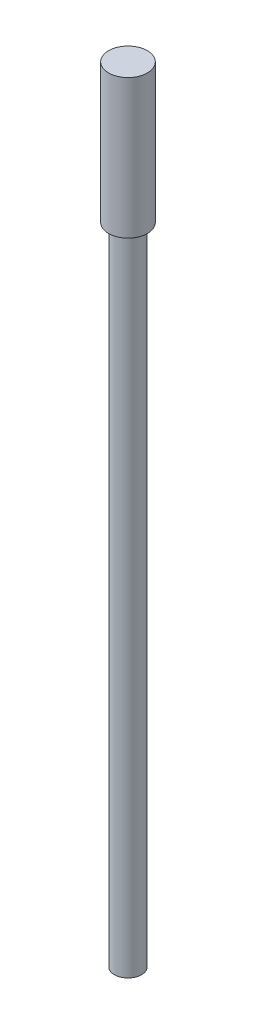
ISO-10303-21;
HEADER;
FILE_DESCRIPTION(('STEP AP214'),'2;1');
FILE_NAME('part.step','',(''),(''),'','','');
FILE_SCHEMA(('AUTOMOTIVE_DESIGN { 1 0 10303 214 1 1 1 1 }'));
ENDSEC;
DATA;
#1=APPLICATION_CONTEXT('core data for automotive mechanical design processes');
#2=APPLICATION_PROTOCOL_DEFINITION('international standard','automotive_design',2000,#1);
#3=PRODUCT_CONTEXT('',#1,'mechanical');
#4=PRODUCT('Part','Part','',(#3));
#5=PRODUCT_RELATED_PRODUCT_CATEGORY('part','',(#4));
#6=PRODUCT_DEFINITION_FORMATION('','',#4);
#7=PRODUCT_DEFINITION_CONTEXT('part definition',#1,'design');
#8=PRODUCT_DEFINITION('design','',#6,#7);
#9=PRODUCT_DEFINITION_SHAPE('','',#8);
#10=(LENGTH_UNIT() NAMED_UNIT(*) SI_UNIT(.MILLI.,.METRE.));
#11=(NAMED_UNIT(*) PLANE_ANGLE_UNIT() SI_UNIT($,.RADIAN.));
#12=(NAMED_UNIT(*) SI_UNIT($,.STERADIAN.) SOLID_ANGLE_UNIT());
#13=UNCERTAINTY_MEASURE_WITH_UNIT(LENGTH_MEASURE(1.E-05),#10,'distance_accuracy_value','');
#14=(GEOMETRIC_REPRESENTATION_CONTEXT(3) GLOBAL_UNCERTAINTY_ASSIGNED_CONTEXT((#13)) GLOBAL_UNIT_ASSIGNED_CONTEXT((#10,
#11,#12)) REPRESENTATION_CONTEXT('',''));
#15=CARTESIAN_POINT('',(0.,0.,0.));
#16=DIRECTION('',(0.,0.,1.));
#17=DIRECTION('',(1.,0.,0.));
#18=AXIS2_PLACEMENT_3D('',#15,#16,#17);
#19=CARTESIAN_POINT('',(0.,620.,0.));
#20=DIRECTION('',(0.,-1.,0.));
#21=DIRECTION('',(0.,0.,-1.));
#22=AXIS2_PLACEMENT_3D('',#19,#20,#21);
#23=CYLINDRICAL_SURFACE('',#22,10.75);
#24=CARTESIAN_POINT('',(0.,0.,0.));
#25=DIRECTION('',(0.,1.,0.));
#26=DIRECTION('',(0.,0.,1.));
#27=AXIS2_PLACEMENT_3D('',#24,#25,#26);
#28=CIRCLE('',#27,10.75);
#29=CARTESIAN_POINT('',(0.,0.,10.75));
#30=VERTEX_POINT('',#29);
#31=EDGE_CURVE('E55',#30,#30,#28,.T.);
#32=ORIENTED_EDGE('',*,*,#31,.T.);
#33=EDGE_LOOP('',(#32));
#34=FACE_BOUND('',#33,.T.);
#35=CARTESIAN_POINT('',(0.,510.,0.));
#36=DIRECTION('',(0.,1.,0.));
#37=DIRECTION('',(0.,0.,1.));
#38=AXIS2_PLACEMENT_3D('',#35,#36,#37);
#39=CIRCLE('',#38,10.75);
#40=CARTESIAN_POINT('',(0.,510.,10.75));
#41=VERTEX_POINT('',#40);
#42=EDGE_CURVE('E12',#41,#41,#39,.T.);
#43=ORIENTED_EDGE('',*,*,#42,.F.);
#44=EDGE_LOOP('',(#43));
#45=FACE_BOUND('',#44,.T.);
#46=ADVANCED_FACE('F48',(#34,#45),#23,.T.);
#47=CARTESIAN_POINT('',(0.,620.,0.));
#48=DIRECTION('',(0.,-1.,0.));
#49=DIRECTION('',(0.,0.,-1.));
#50=AXIS2_PLACEMENT_3D('',#47,#48,#49);
#51=CYLINDRICAL_SURFACE('',#50,7.75);
#52=CARTESIAN_POINT('',(0.,0.,0.));
#53=DIRECTION('',(0.,1.,0.));
#54=DIRECTION('',(0.,0.,1.));
#55=AXIS2_PLACEMENT_3D('',#52,#53,#54);
#56=CIRCLE('',#55,7.75);
#57=CARTESIAN_POINT('',(0.,0.,7.75000000000002));
#58=VERTEX_POINT('',#57);
#59=EDGE_CURVE('E60',#58,#58,#56,.T.);
#60=ORIENTED_EDGE('',*,*,#59,.F.);
#61=EDGE_LOOP('',(#60));
#62=FACE_BOUND('',#61,.T.);
#63=CARTESIAN_POINT('',(0.,510.,0.));
#64=DIRECTION('',(0.,1.,0.));
#65=DIRECTION('',(0.,0.,1.));
#66=AXIS2_PLACEMENT_3D('',#63,#64,#65);
#67=CIRCLE('',#66,7.75);
#68=CARTESIAN_POINT('',(0.,510.,7.75000000000002));
#69=VERTEX_POINT('',#68);
#70=EDGE_CURVE('E51',#69,#69,#67,.T.);
#71=ORIENTED_EDGE('',*,*,#70,.T.);
#72=EDGE_LOOP('',(#71));
#73=FACE_BOUND('',#72,.T.);
#74=ADVANCED_FACE('F94',(#62,#73),#51,.F.);
#75=CARTESIAN_POINT('',(0.,0.,0.));
#76=DIRECTION('',(0.,1.,0.));
#77=DIRECTION('',(0.,0.,1.));
#78=AXIS2_PLACEMENT_3D('',#75,#76,#77);
#79=PLANE('',#78);
#80=ORIENTED_EDGE('',*,*,#31,.F.);
#81=EDGE_LOOP('',(#80));
#82=FACE_BOUND('',#81,.T.);
#83=ORIENTED_EDGE('',*,*,#59,.T.);
#84=EDGE_LOOP('',(#83));
#85=FACE_BOUND('',#84,.T.);
#86=ADVANCED_FACE('F90',(#82,#85),#79,.F.);
#87=CARTESIAN_POINT('',(0.,510.,0.));
#88=DIRECTION('',(0.,1.,0.));
#89=DIRECTION('',(0.,0.,1.));
#90=AXIS2_PLACEMENT_3D('',#87,#88,#89);
#91=PLANE('',#90);
#92=ORIENTED_EDGE('',*,*,#70,.F.);
#93=EDGE_LOOP('',(#92));
#94=FACE_BOUND('',#93,.T.);
#95=ADVANCED_FACE('F83',(#94),#91,.F.);
#96=CARTESIAN_POINT('',(0.,510.,0.));
#97=DIRECTION('',(0.,1.,0.));
#98=DIRECTION('',(0.,0.,1.));
#99=AXIS2_PLACEMENT_3D('',#96,#97,#98);
#100=CYLINDRICAL_SURFACE('',#99,15.3015806275291);
#101=CARTESIAN_POINT('',(0.,510.,0.));
#102=DIRECTION('',(0.,1.,0.));
#103=DIRECTION('',(0.,0.,1.));
#104=AXIS2_PLACEMENT_3D('',#101,#102,#103);
#105=CIRCLE('',#104,15.3015806275291);
#106=CARTESIAN_POINT('',(0.,510.,15.3015806275292));
#107=VERTEX_POINT('',#106);
#108=EDGE_CURVE('E69',#107,#107,#105,.T.);
#109=ORIENTED_EDGE('',*,*,#108,.T.);
#110=EDGE_LOOP('',(#109));
#111=FACE_BOUND('',#110,.T.);
#112=CARTESIAN_POINT('',(0.,620.,0.));
#113=DIRECTION('',(0.,1.,0.));
#114=DIRECTION('',(0.,0.,1.));
#115=AXIS2_PLACEMENT_3D('',#112,#113,#114);
#116=CIRCLE('',#115,15.3015806275291);
#117=CARTESIAN_POINT('',(0.,620.,15.3015806275292));
#118=VERTEX_POINT('',#117);
#119=EDGE_CURVE('E63',#118,#118,#116,.T.);
#120=ORIENTED_EDGE('',*,*,#119,.F.);
#121=EDGE_LOOP('',(#120));
#122=FACE_BOUND('',#121,.T.);
#123=ADVANCED_FACE('F80',(#111,#122),#100,.T.);
#124=ORIENTED_EDGE('',*,*,#42,.T.);
#125=EDGE_LOOP('',(#124));
#126=FACE_BOUND('',#125,.T.);
#127=ORIENTED_EDGE('',*,*,#108,.F.);
#128=EDGE_LOOP('',(#127));
#129=FACE_BOUND('',#128,.T.);
#130=ADVANCED_FACE('F82',(#126,#129),#91,.F.);
#131=CARTESIAN_POINT('',(0.,620.,0.));
#132=DIRECTION('',(0.,1.,0.));
#133=DIRECTION('',(0.,0.,1.));
#134=AXIS2_PLACEMENT_3D('',#131,#132,#133);
#135=PLANE('',#134);
#136=ORIENTED_EDGE('',*,*,#119,.T.);
#137=EDGE_LOOP('',(#136));
#138=FACE_BOUND('',#137,.T.);
#139=ADVANCED_FACE('F78',(#138),#135,.T.);
#140=CLOSED_SHELL('',(#46,#74,#86,#95,#123,#130,#139));
#141=MANIFOLD_SOLID_BREP('B2',#140);
#142=ADVANCED_BREP_SHAPE_REPRESENTATION('',(#18,#141),#14);
#143=SHAPE_DEFINITION_REPRESENTATION(#9,#142);
ENDSEC;
END-ISO-10303-21;
